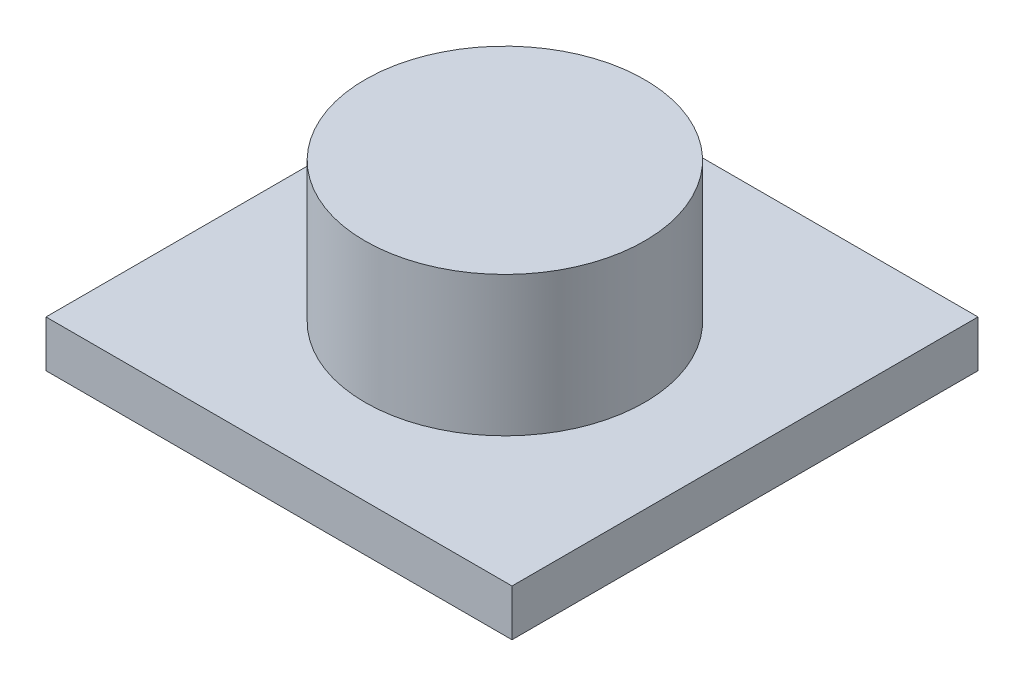
ISO-10303-21;
HEADER;
FILE_DESCRIPTION(('STEP AP214'),'2;1');
FILE_NAME('part.step','',(''),(''),'','','');
FILE_SCHEMA(('AUTOMOTIVE_DESIGN { 1 0 10303 214 1 1 1 1 }'));
ENDSEC;
DATA;
#1=APPLICATION_CONTEXT('core data for automotive mechanical design processes');
#2=APPLICATION_PROTOCOL_DEFINITION('international standard','automotive_design',2000,#1);
#3=PRODUCT_CONTEXT('',#1,'mechanical');
#4=PRODUCT('Part','Part','',(#3));
#5=PRODUCT_RELATED_PRODUCT_CATEGORY('part','',(#4));
#6=PRODUCT_DEFINITION_FORMATION('','',#4);
#7=PRODUCT_DEFINITION_CONTEXT('part definition',#1,'design');
#8=PRODUCT_DEFINITION('design','',#6,#7);
#9=PRODUCT_DEFINITION_SHAPE('','',#8);
#10=(LENGTH_UNIT() NAMED_UNIT(*) SI_UNIT(.MILLI.,.METRE.));
#11=(NAMED_UNIT(*) PLANE_ANGLE_UNIT() SI_UNIT($,.RADIAN.));
#12=(NAMED_UNIT(*) SI_UNIT($,.STERADIAN.) SOLID_ANGLE_UNIT());
#13=UNCERTAINTY_MEASURE_WITH_UNIT(LENGTH_MEASURE(1.E-05),#10,'distance_accuracy_value','');
#14=(GEOMETRIC_REPRESENTATION_CONTEXT(3) GLOBAL_UNCERTAINTY_ASSIGNED_CONTEXT((#13)) GLOBAL_UNIT_ASSIGNED_CONTEXT((#10,
#11,#12)) REPRESENTATION_CONTEXT('',''));
#15=CARTESIAN_POINT('',(0.,0.,0.));
#16=DIRECTION('',(0.,0.,1.));
#17=DIRECTION('',(1.,0.,0.));
#18=AXIS2_PLACEMENT_3D('',#15,#16,#17);
#19=CARTESIAN_POINT('',(-5.01247434022832,1.,-4.05851394504861));
#20=DIRECTION('',(1.,0.,0.));
#21=DIRECTION('',(0.,0.,-1.));
#22=AXIS2_PLACEMENT_3D('',#19,#20,#21);
#23=PLANE('',#22);
#24=DIRECTION('',(0.,0.,1.));
#25=VECTOR('',#24,1.);
#26=CARTESIAN_POINT('',(-5.01247434022832,0.,-4.05851394504861));
#27=LINE('',#26,#25);
#28=CARTESIAN_POINT('',(-5.01247434022832,0.,-4.05851394504861));
#29=VERTEX_POINT('',#28);
#30=CARTESIAN_POINT('',(-5.01247434022832,0.,5.94148605495139));
#31=VERTEX_POINT('',#30);
#32=EDGE_CURVE('E98',#29,#31,#27,.T.);
#33=ORIENTED_EDGE('',*,*,#32,.T.);
#34=DIRECTION('',(0.,-1.,0.));
#35=VECTOR('',#34,1.);
#36=CARTESIAN_POINT('',(-5.01247434022832,1.,5.94148605495139));
#37=LINE('',#36,#35);
#38=CARTESIAN_POINT('',(-5.01247434022832,1.,5.94148605495139));
#39=VERTEX_POINT('',#38);
#40=EDGE_CURVE('E35',#39,#31,#37,.T.);
#41=ORIENTED_EDGE('',*,*,#40,.F.);
#42=DIRECTION('',(0.,0.,1.));
#43=VECTOR('',#42,1.);
#44=CARTESIAN_POINT('',(-5.01247434022832,1.,-4.05851394504861));
#45=LINE('',#44,#43);
#46=CARTESIAN_POINT('',(-5.01247434022832,1.,-4.05851394504861));
#47=VERTEX_POINT('',#46);
#48=EDGE_CURVE('E85',#47,#39,#45,.T.);
#49=ORIENTED_EDGE('',*,*,#48,.F.);
#50=DIRECTION('',(0.,-1.,0.));
#51=VECTOR('',#50,1.);
#52=CARTESIAN_POINT('',(-5.01247434022832,1.,-4.05851394504861));
#53=LINE('',#52,#51);
#54=EDGE_CURVE('E94',#47,#29,#53,.T.);
#55=ORIENTED_EDGE('',*,*,#54,.T.);
#56=EDGE_LOOP('',(#33,#41,#49,#55));
#57=FACE_BOUND('',#56,.T.);
#58=ADVANCED_FACE('F32',(#57),#23,.F.);
#59=CARTESIAN_POINT('',(-5.01247434022832,1.,5.94148605495139));
#60=DIRECTION('',(0.,0.,-1.));
#61=DIRECTION('',(-1.,0.,0.));
#62=AXIS2_PLACEMENT_3D('',#59,#60,#61);
#63=PLANE('',#62);
#64=DIRECTION('',(1.,0.,0.));
#65=VECTOR('',#64,1.);
#66=CARTESIAN_POINT('',(-5.01247434022832,0.,5.94148605495139));
#67=LINE('',#66,#65);
#68=CARTESIAN_POINT('',(4.98752565977168,0.,5.94148605495139));
#69=VERTEX_POINT('',#68);
#70=EDGE_CURVE('E90',#31,#69,#67,.T.);
#71=ORIENTED_EDGE('',*,*,#70,.T.);
#72=DIRECTION('',(0.,-1.,0.));
#73=VECTOR('',#72,1.);
#74=CARTESIAN_POINT('',(4.98752565977168,1.,5.94148605495139));
#75=LINE('',#74,#73);
#76=CARTESIAN_POINT('',(4.98752565977168,1.,5.94148605495139));
#77=VERTEX_POINT('',#76);
#78=EDGE_CURVE('E88',#77,#69,#75,.T.);
#79=ORIENTED_EDGE('',*,*,#78,.F.);
#80=DIRECTION('',(1.,0.,0.));
#81=VECTOR('',#80,1.);
#82=CARTESIAN_POINT('',(-5.01247434022832,1.,5.94148605495139));
#83=LINE('',#82,#81);
#84=EDGE_CURVE('E80',#39,#77,#83,.T.);
#85=ORIENTED_EDGE('',*,*,#84,.F.);
#86=ORIENTED_EDGE('',*,*,#40,.T.);
#87=EDGE_LOOP('',(#71,#79,#85,#86));
#88=FACE_BOUND('',#87,.T.);
#89=ADVANCED_FACE('F89',(#88),#63,.F.);
#90=CARTESIAN_POINT('',(4.98752565977168,1.,-4.05851394504861));
#91=DIRECTION('',(-1.,0.,0.));
#92=DIRECTION('',(0.,0.,1.));
#93=AXIS2_PLACEMENT_3D('',#90,#91,#92);
#94=PLANE('',#93);
#95=DIRECTION('',(0.,0.,-1.));
#96=VECTOR('',#95,1.);
#97=CARTESIAN_POINT('',(4.98752565977168,0.,-4.05851394504861));
#98=LINE('',#97,#96);
#99=CARTESIAN_POINT('',(4.98752565977168,0.,-4.05851394504861));
#100=VERTEX_POINT('',#99);
#101=EDGE_CURVE('E66',#69,#100,#98,.T.);
#102=ORIENTED_EDGE('',*,*,#101,.T.);
#103=DIRECTION('',(0.,-1.,0.));
#104=VECTOR('',#103,1.);
#105=CARTESIAN_POINT('',(4.98752565977168,1.,-4.05851394504861));
#106=LINE('',#105,#104);
#107=CARTESIAN_POINT('',(4.98752565977168,1.,-4.05851394504861));
#108=VERTEX_POINT('',#107);
#109=EDGE_CURVE('E91',#108,#100,#106,.T.);
#110=ORIENTED_EDGE('',*,*,#109,.F.);
#111=DIRECTION('',(0.,0.,-1.));
#112=VECTOR('',#111,1.);
#113=CARTESIAN_POINT('',(4.98752565977168,1.,-4.05851394504861));
#114=LINE('',#113,#112);
#115=EDGE_CURVE('E83',#77,#108,#114,.T.);
#116=ORIENTED_EDGE('',*,*,#115,.F.);
#117=ORIENTED_EDGE('',*,*,#78,.T.);
#118=EDGE_LOOP('',(#102,#110,#116,#117));
#119=FACE_BOUND('',#118,.T.);
#120=ADVANCED_FACE('F92',(#119),#94,.F.);
#121=CARTESIAN_POINT('',(-5.01247434022832,1.,-4.05851394504861));
#122=DIRECTION('',(0.,0.,1.));
#123=DIRECTION('',(1.,0.,0.));
#124=AXIS2_PLACEMENT_3D('',#121,#122,#123);
#125=PLANE('',#124);
#126=DIRECTION('',(-1.,0.,0.));
#127=VECTOR('',#126,1.);
#128=CARTESIAN_POINT('',(-5.01247434022832,0.,-4.05851394504861));
#129=LINE('',#128,#127);
#130=EDGE_CURVE('E72',#100,#29,#129,.T.);
#131=ORIENTED_EDGE('',*,*,#130,.T.);
#132=ORIENTED_EDGE('',*,*,#54,.F.);
#133=DIRECTION('',(-1.,0.,0.));
#134=VECTOR('',#133,1.);
#135=CARTESIAN_POINT('',(-5.01247434022832,1.,-4.05851394504861));
#136=LINE('',#135,#134);
#137=EDGE_CURVE('E49',#108,#47,#136,.T.);
#138=ORIENTED_EDGE('',*,*,#137,.F.);
#139=ORIENTED_EDGE('',*,*,#109,.T.);
#140=EDGE_LOOP('',(#131,#132,#138,#139));
#141=FACE_BOUND('',#140,.T.);
#142=ADVANCED_FACE('F106',(#141),#125,.F.);
#143=CARTESIAN_POINT('',(0.,1.,0.));
#144=DIRECTION('',(0.,1.,0.));
#145=DIRECTION('',(0.,0.,1.));
#146=AXIS2_PLACEMENT_3D('',#143,#144,#145);
#147=PLANE('',#146);
#148=CARTESIAN_POINT('',(0.,1.,1.1070367532966));
#149=DIRECTION('',(0.,1.,0.));
#150=DIRECTION('',(0.,0.,1.));
#151=AXIS2_PLACEMENT_3D('',#148,#149,#150);
#152=CIRCLE('',#151,3.);
#153=CARTESIAN_POINT('',(0.,1.,4.1070367532966));
#154=VERTEX_POINT('',#153);
#155=EDGE_CURVE('E11',#154,#154,#152,.T.);
#156=ORIENTED_EDGE('',*,*,#155,.F.);
#157=EDGE_LOOP('',(#156));
#158=FACE_BOUND('',#157,.T.);
#159=ORIENTED_EDGE('',*,*,#48,.T.);
#160=ORIENTED_EDGE('',*,*,#84,.T.);
#161=ORIENTED_EDGE('',*,*,#115,.T.);
#162=ORIENTED_EDGE('',*,*,#137,.T.);
#163=EDGE_LOOP('',(#159,#160,#161,#162));
#164=FACE_BOUND('',#163,.T.);
#165=ADVANCED_FACE('F81',(#158,#164),#147,.T.);
#166=CARTESIAN_POINT('',(0.,0.,0.));
#167=DIRECTION('',(0.,1.,0.));
#168=DIRECTION('',(0.,0.,1.));
#169=AXIS2_PLACEMENT_3D('',#166,#167,#168);
#170=PLANE('',#169);
#171=ORIENTED_EDGE('',*,*,#32,.F.);
#172=ORIENTED_EDGE('',*,*,#130,.F.);
#173=ORIENTED_EDGE('',*,*,#101,.F.);
#174=ORIENTED_EDGE('',*,*,#70,.F.);
#175=EDGE_LOOP('',(#171,#172,#173,#174));
#176=FACE_BOUND('',#175,.T.);
#177=ADVANCED_FACE('F109',(#176),#170,.F.);
#178=CARTESIAN_POINT('',(0.,4.,1.1070367532966));
#179=DIRECTION('',(0.,-1.,0.));
#180=DIRECTION('',(0.,0.,-1.));
#181=AXIS2_PLACEMENT_3D('',#178,#179,#180);
#182=CYLINDRICAL_SURFACE('',#181,3.);
#183=CARTESIAN_POINT('',(0.,4.,1.1070367532966));
#184=DIRECTION('',(0.,1.,0.));
#185=DIRECTION('',(0.,0.,1.));
#186=AXIS2_PLACEMENT_3D('',#183,#184,#185);
#187=CIRCLE('',#186,3.);
#188=CARTESIAN_POINT('',(0.,4.,4.1070367532966));
#189=VERTEX_POINT('',#188);
#190=EDGE_CURVE('E101',#189,#189,#187,.T.);
#191=ORIENTED_EDGE('',*,*,#190,.F.);
#192=EDGE_LOOP('',(#191));
#193=FACE_BOUND('',#192,.T.);
#194=ORIENTED_EDGE('',*,*,#155,.T.);
#195=EDGE_LOOP('',(#194));
#196=FACE_BOUND('',#195,.T.);
#197=ADVANCED_FACE('F117',(#193,#196),#182,.T.);
#198=CARTESIAN_POINT('',(0.,4.,1.1070367532966));
#199=DIRECTION('',(0.,1.,0.));
#200=DIRECTION('',(0.,0.,1.));
#201=AXIS2_PLACEMENT_3D('',#198,#199,#200);
#202=PLANE('',#201);
#203=ORIENTED_EDGE('',*,*,#190,.T.);
#204=EDGE_LOOP('',(#203));
#205=FACE_BOUND('',#204,.T.);
#206=ADVANCED_FACE('F115',(#205),#202,.T.);
#207=CLOSED_SHELL('',(#58,#89,#120,#142,#165,#177,#197,#206));
#208=MANIFOLD_SOLID_BREP('B2',#207);
#209=ADVANCED_BREP_SHAPE_REPRESENTATION('',(#18,#208),#14);
#210=SHAPE_DEFINITION_REPRESENTATION(#9,#209);
ENDSEC;
END-ISO-10303-21;
